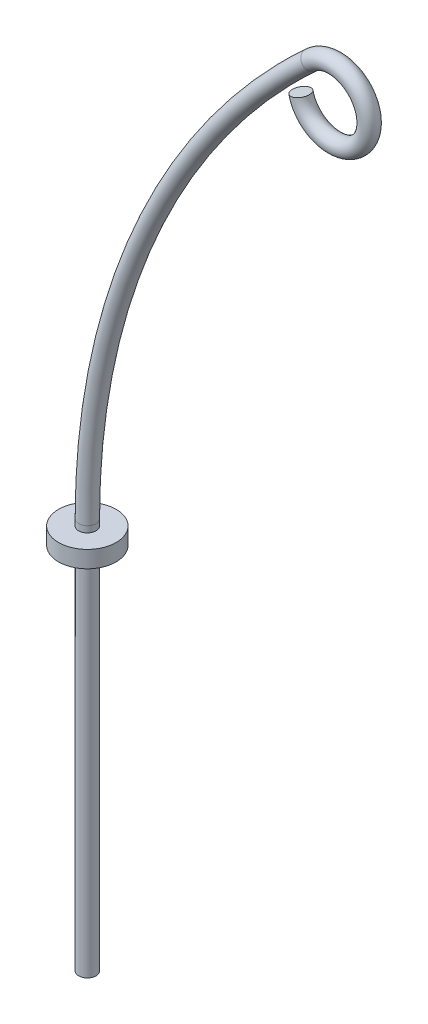
ISO-10303-21;
HEADER;
FILE_DESCRIPTION(('STEP AP214'),'2;1');
FILE_NAME('part.step','',(''),(''),'','','');
FILE_SCHEMA(('AUTOMOTIVE_DESIGN { 1 0 10303 214 1 1 1 1 }'));
ENDSEC;
DATA;
#1=APPLICATION_CONTEXT('core data for automotive mechanical design processes');
#2=APPLICATION_PROTOCOL_DEFINITION('international standard','automotive_design',2000,#1);
#3=PRODUCT_CONTEXT('',#1,'mechanical');
#4=PRODUCT('Part','Part','',(#3));
#5=PRODUCT_RELATED_PRODUCT_CATEGORY('part','',(#4));
#6=PRODUCT_DEFINITION_FORMATION('','',#4);
#7=PRODUCT_DEFINITION_CONTEXT('part definition',#1,'design');
#8=PRODUCT_DEFINITION('design','',#6,#7);
#9=PRODUCT_DEFINITION_SHAPE('','',#8);
#10=(LENGTH_UNIT() NAMED_UNIT(*) SI_UNIT(.MILLI.,.METRE.));
#11=(NAMED_UNIT(*) PLANE_ANGLE_UNIT() SI_UNIT($,.RADIAN.));
#12=(NAMED_UNIT(*) SI_UNIT($,.STERADIAN.) SOLID_ANGLE_UNIT());
#13=UNCERTAINTY_MEASURE_WITH_UNIT(LENGTH_MEASURE(1.E-05),#10,'distance_accuracy_value','');
#14=(GEOMETRIC_REPRESENTATION_CONTEXT(3) GLOBAL_UNCERTAINTY_ASSIGNED_CONTEXT((#13)) GLOBAL_UNIT_ASSIGNED_CONTEXT((#10,
#11,#12)) REPRESENTATION_CONTEXT('',''));
#15=CARTESIAN_POINT('',(0.,0.,0.));
#16=DIRECTION('',(0.,0.,1.));
#17=DIRECTION('',(1.,0.,0.));
#18=AXIS2_PLACEMENT_3D('',#15,#16,#17);
#19=CARTESIAN_POINT('',(0.,0.,0.));
#20=DIRECTION('',(0.,1.,0.));
#21=DIRECTION('',(0.,0.,1.));
#22=AXIS2_PLACEMENT_3D('',#19,#20,#21);
#23=PLANE('',#22);
#24=CARTESIAN_POINT('',(0.,0.,0.));
#25=DIRECTION('',(0.,1.,0.));
#26=DIRECTION('',(0.,0.,1.));
#27=AXIS2_PLACEMENT_3D('',#24,#25,#26);
#28=CIRCLE('',#27,0.9525);
#29=CARTESIAN_POINT('',(0.,0.,0.9525));
#30=VERTEX_POINT('',#29);
#31=EDGE_CURVE('E17',#30,#30,#28,.T.);
#32=ORIENTED_EDGE('',*,*,#31,.F.);
#33=EDGE_LOOP('',(#32));
#34=FACE_BOUND('',#33,.T.);
#35=ADVANCED_FACE('F14',(#34),#23,.F.);
#36=CARTESIAN_POINT('',(0.,0.,0.));
#37=DIRECTION('',(0.,1.,0.));
#38=DIRECTION('',(0.,0.,1.));
#39=AXIS2_PLACEMENT_3D('',#36,#37,#38);
#40=CYLINDRICAL_SURFACE('',#39,0.9525);
#41=ORIENTED_EDGE('',*,*,#31,.T.);
#42=EDGE_LOOP('',(#41));
#43=FACE_BOUND('',#42,.T.);
#44=CARTESIAN_POINT('',(0.,40.64,0.));
#45=DIRECTION('',(0.,1.,0.));
#46=DIRECTION('',(0.,0.,1.));
#47=AXIS2_PLACEMENT_3D('',#44,#45,#46);
#48=CIRCLE('',#47,0.9525);
#49=CARTESIAN_POINT('',(0.,40.64,0.9525));
#50=VERTEX_POINT('',#49);
#51=EDGE_CURVE('E99',#50,#50,#48,.F.);
#52=ORIENTED_EDGE('',*,*,#51,.T.);
#53=EDGE_LOOP('',(#52));
#54=FACE_BOUND('',#53,.T.);
#55=ADVANCED_FACE('F58',(#43,#54),#40,.T.);
#56=CARTESIAN_POINT('',(0.,40.64,0.));
#57=DIRECTION('',(0.,1.,0.));
#58=DIRECTION('',(0.,0.,1.));
#59=AXIS2_PLACEMENT_3D('',#56,#57,#58);
#60=PLANE('',#59);
#61=ORIENTED_EDGE('',*,*,#51,.F.);
#62=EDGE_LOOP('',(#61));
#63=FACE_BOUND('',#62,.T.);
#64=CARTESIAN_POINT('',(0.,40.64,0.));
#65=DIRECTION('',(0.,1.,0.));
#66=DIRECTION('',(0.,0.,1.));
#67=AXIS2_PLACEMENT_3D('',#64,#65,#66);
#68=CIRCLE('',#67,3.175);
#69=CARTESIAN_POINT('',(0.,40.64,3.175));
#70=VERTEX_POINT('',#69);
#71=EDGE_CURVE('E97',#70,#70,#68,.T.);
#72=ORIENTED_EDGE('',*,*,#71,.F.);
#73=EDGE_LOOP('',(#72));
#74=FACE_BOUND('',#73,.T.);
#75=ADVANCED_FACE('F55',(#63,#74),#60,.F.);
#76=CARTESIAN_POINT('',(0.,40.54729,0.));
#77=DIRECTION('',(0.,1.,0.));
#78=DIRECTION('',(0.,0.,1.));
#79=AXIS2_PLACEMENT_3D('',#76,#77,#78);
#80=CYLINDRICAL_SURFACE('',#79,3.175);
#81=ORIENTED_EDGE('',*,*,#71,.T.);
#82=EDGE_LOOP('',(#81));
#83=FACE_BOUND('',#82,.T.);
#84=CARTESIAN_POINT('',(0.,42.4942,0.));
#85=DIRECTION('',(0.,1.,0.));
#86=DIRECTION('',(0.,0.,1.));
#87=AXIS2_PLACEMENT_3D('',#84,#85,#86);
#88=CIRCLE('',#87,3.175);
#89=CARTESIAN_POINT('',(0.,42.4942,3.175));
#90=VERTEX_POINT('',#89);
#91=EDGE_CURVE('E40',#90,#90,#88,.T.);
#92=ORIENTED_EDGE('',*,*,#91,.F.);
#93=EDGE_LOOP('',(#92));
#94=FACE_BOUND('',#93,.T.);
#95=ADVANCED_FACE('F51',(#83,#94),#80,.T.);
#96=CARTESIAN_POINT('',(27.2596638752859,96.52,25.4));
#97=DIRECTION('',(-0.217068301612814,0.976156418016564,0.));
#98=DIRECTION('',(-0.976156418016564,-0.217068301612814,0.));
#99=AXIS2_PLACEMENT_3D('',#96,#97,#98);
#100=PLANE('',#99);
#101=CARTESIAN_POINT('',(24.4702969108035,95.8997273281414,0.));
#102=CARTESIAN_POINT('',(24.4702904445418,95.8997258902361,0.0534761719287761));
#103=CARTESIAN_POINT('',(24.4658783235665,95.8987447650917,0.107022651500153));
#104=CARTESIAN_POINT('',(24.452741678356,95.8958235639275,0.186169109245371));
#105=CARTESIAN_POINT('',(24.4472650376949,95.8946057211055,0.212388948246664));
#106=CARTESIAN_POINT('',(24.4341716634949,95.8916941421336,0.264288462679879));
#107=CARTESIAN_POINT('',(24.4265530853444,95.8899999957967,0.289967651930992));
#108=CARTESIAN_POINT('',(24.4005862120776,95.8842257315761,0.365791602146631));
#109=CARTESIAN_POINT('',(24.3791053079268,95.8794490141412,0.414851299745768));
#110=CARTESIAN_POINT('',(24.3284181131509,95.8681776819239,0.508555711509735));
#111=CARTESIAN_POINT('',(24.2992116455692,95.8616830277916,0.553200324513418));
#112=CARTESIAN_POINT('',(24.2338957453563,95.8471587043678,0.636837203748042));
#113=CARTESIAN_POINT('',(24.1977866890783,95.8391291187661,0.675829777944051));
#114=CARTESIAN_POINT('',(24.1196884664604,95.8217623850851,0.747052786685603));
#115=CARTESIAN_POINT('',(24.0776987940299,95.8124251244663,0.779282638628786));
#116=CARTESIAN_POINT('',(23.989034827213,95.7927088819297,0.836062294452608));
#117=CARTESIAN_POINT('',(23.9423607095576,95.7823299393118,0.860612387925209));
#118=CARTESIAN_POINT('',(23.8456521639588,95.7608248205039,0.901336413052785));
#119=CARTESIAN_POINT('',(23.7956177719113,95.7496986522961,0.917510434168126));
#120=CARTESIAN_POINT('',(23.6936082302561,95.7270147488287,0.941023820093909));
#121=CARTESIAN_POINT('',(23.6416330702855,95.7154570112646,0.948363137723286));
#122=CARTESIAN_POINT('',(23.5372176748056,95.692238117099,0.953998559438798));
#123=CARTESIAN_POINT('',(23.4847774392963,95.6805769604973,0.952294663524934));
#124=CARTESIAN_POINT('',(23.3809208084941,95.6574823190614,0.939892117082394));
#125=CARTESIAN_POINT('',(23.3295044077348,95.6460488330116,0.929193514589103));
#126=CARTESIAN_POINT('',(23.2291541051655,95.6237338952178,0.899104987293012));
#127=CARTESIAN_POINT('',(23.1802202298763,95.6128524493712,0.879714969661146));
#128=CARTESIAN_POINT('',(23.086223121062,95.5919502738692,0.832793746949218));
#129=CARTESIAN_POINT('',(23.0411600335857,95.5819295766906,0.805262234856397));
#130=CARTESIAN_POINT('',(22.9561887008419,95.563034466702,0.74284028183274));
#131=CARTESIAN_POINT('',(22.916280012044,95.554159955264,0.707950474756428));
#132=CARTESIAN_POINT('',(22.8427469299702,95.5378083737516,0.631807438420719));
#133=CARTESIAN_POINT('',(22.8091228793756,95.5303313798793,0.590553862389127));
#134=CARTESIAN_POINT('',(22.7491048771284,95.5169851521912,0.502824340328516));
#135=CARTESIAN_POINT('',(22.722710759875,95.5111158815507,0.456348513948862));
#136=CARTESIAN_POINT('',(22.6891102564452,95.5036441238711,0.383739485121294));
#137=CARTESIAN_POINT('',(22.6788998997027,95.5013736426695,0.359022544458131));
#138=CARTESIAN_POINT('',(22.6605555953866,95.4972944122217,0.308819758513858));
#139=CARTESIAN_POINT('',(22.6524198632813,95.4954852661485,0.283334595282693));
#140=CARTESIAN_POINT('',(22.6312377661943,95.4907749945625,0.206040360427623));
#141=CARTESIAN_POINT('',(22.6213577247161,95.4885779657012,0.153265245675408));
#142=CARTESIAN_POINT('',(22.6124328717984,95.4865933425105,0.0668383901907822));
#143=CARTESIAN_POINT('',(22.6107148918195,95.4862113146005,0.0334329355449093));
#144=CARTESIAN_POINT('',(22.6107254007437,95.4862136514742,-0.0534761719287885));
#145=CARTESIAN_POINT('',(22.615137521719,95.4871947766187,-0.107022651500165));
#146=CARTESIAN_POINT('',(22.6282741669295,95.4901159777828,-0.186169109245384));
#147=CARTESIAN_POINT('',(22.6337508075906,95.4913338206049,-0.212388948246677));
#148=CARTESIAN_POINT('',(22.6468441817906,95.4942453995768,-0.264288462679892));
#149=CARTESIAN_POINT('',(22.6544627599411,95.4959395459137,-0.289967651931004));
#150=CARTESIAN_POINT('',(22.6804296332079,95.5017138101342,-0.365791602146642));
#151=CARTESIAN_POINT('',(22.7019105373587,95.5064905275691,-0.414851299745783));
#152=CARTESIAN_POINT('',(22.7525977321346,95.5177618597864,-0.508555711509751));
#153=CARTESIAN_POINT('',(22.7818041997164,95.5242565139188,-0.553200324513429));
#154=CARTESIAN_POINT('',(22.8471200999292,95.5387808373426,-0.636837203748051));
#155=CARTESIAN_POINT('',(22.8832291562072,95.5468104229443,-0.675829777944063));
#156=CARTESIAN_POINT('',(22.9613273788252,95.5641771566252,-0.747052786685616));
#157=CARTESIAN_POINT('',(23.0033170512556,95.5735144172441,-0.779282638628796));
#158=CARTESIAN_POINT('',(23.0919810180725,95.5932306597806,-0.836062294452616));
#159=CARTESIAN_POINT('',(23.138655135728,95.6036096023985,-0.860612387925217));
#160=CARTESIAN_POINT('',(23.2353636813267,95.6251147212065,-0.901336413052792));
#161=CARTESIAN_POINT('',(23.2853980733742,95.6362408894143,-0.91751043416813));
#162=CARTESIAN_POINT('',(23.3874076150294,95.6589247928817,-0.941023820093911));
#163=CARTESIAN_POINT('',(23.439382775,95.6704825304457,-0.948363137723288));
#164=CARTESIAN_POINT('',(23.5437981704799,95.6937014246114,-0.953998559438799));
#165=CARTESIAN_POINT('',(23.5962384059892,95.705362581213,-0.952294663524934));
#166=CARTESIAN_POINT('',(23.7000950367915,95.7284572226489,-0.93989211708239));
#167=CARTESIAN_POINT('',(23.7515114375507,95.7398907086988,-0.929193514589098));
#168=CARTESIAN_POINT('',(23.85186174012,95.7622056464926,-0.899104987293007));
#169=CARTESIAN_POINT('',(23.9007956154093,95.7730870923391,-0.879714969661141));
#170=CARTESIAN_POINT('',(23.9947927242235,95.7939892678411,-0.832793746949211));
#171=CARTESIAN_POINT('',(24.0398558116998,95.8040099650198,-0.805262234856388));
#172=CARTESIAN_POINT('',(24.1248271444436,95.8229050750083,-0.74284028183273));
#173=CARTESIAN_POINT('',(24.1647358332416,95.8317795864463,-0.707950474756419));
#174=CARTESIAN_POINT('',(24.2382689153153,95.8481311679588,-0.631807438420709));
#175=CARTESIAN_POINT('',(24.2718929659099,95.8556081618311,-0.590553862389116));
#176=CARTESIAN_POINT('',(24.3319109681572,95.8689543895191,-0.502824340328505));
#177=CARTESIAN_POINT('',(24.3583050854106,95.8748236601596,-0.456348513948855));
#178=CARTESIAN_POINT('',(24.3919055888404,95.8822954178392,-0.383739485121286));
#179=CARTESIAN_POINT('',(24.4021159455828,95.8845658990409,-0.35902254445812));
#180=CARTESIAN_POINT('',(24.4204602498989,95.8886451294886,-0.308819758513846));
#181=CARTESIAN_POINT('',(24.4285959820043,95.8904542755618,-0.283334595282681));
#182=CARTESIAN_POINT('',(24.4497780790912,95.8951645471478,-0.206040360427613));
#183=CARTESIAN_POINT('',(24.4596581205694,95.8973615760091,-0.153265245675397));
#184=CARTESIAN_POINT('',(24.4685829734871,95.8993461991999,-0.0668383901907789));
#185=CARTESIAN_POINT('',(24.470300953466,95.8997282271099,-0.0334329355449141));
#186=CARTESIAN_POINT('',(24.4702969108035,95.8997273281414,0.));
#187=B_SPLINE_CURVE_WITH_KNOTS('',3,(#101,#102,#103,#104,#105,#106,#107,#108,#109,#110,#111,
#112,#113,#114,#115,#116,#117,#118,#119,#120,#121,#122,#123,#124,#125,#126,#127,#128,#129,#130,
#131,#132,#133,#134,#135,#136,#137,#138,#139,#140,#141,#142,#143,#144,#145,#146,#147,#148,#149,
#150,#151,#152,#153,#154,#155,#156,#157,#158,#159,#160,#161,#162,#163,#164,#165,#166,#167,#168,
#169,#170,#171,#172,#173,#174,#175,#176,#177,#178,#179,#180,#181,#182,#183,#184,#185,#186),
.UNSPECIFIED.,.T.,.F.,(4,2,2,2,2,2,2,2,2,2,2,2,2,2,2,2,2,2,2,2,2,2,2,2,2,2,2,2,2,2,2,2,2,2,2,2,
2,2,2,2,2,2,4),(0.,0.16030984359682,0.240673423468533,0.321106424636362,0.481586166402148,
0.642069584327493,0.802544254634194,0.963032744016644,1.12351518089362,1.28399590370789,
1.44447748355354,1.60495906339918,1.76543978621346,1.92592222309043,2.08641071247288,
2.24688538277958,2.40736880070493,2.56784854247072,2.64828154363855,2.72864512351026,
2.88895496710708,2.98917958070369,3.14948942430051,3.22985300417223,3.31028600534005,
3.47076574710584,3.63124916503119,3.79172383533789,3.95221232472034,4.11269476159732,
4.27317548441159,4.43365706425723,4.59413864410287,4.75461936691714,4.91510180379412,
5.07559029317658,5.23606496348328,5.39654838140862,5.55702812317441,5.63746112434224,
5.71782470421395,5.87813454781077,5.97835916140736),.UNSPECIFIED.);
#188=CARTESIAN_POINT('',(24.4702969108035,95.8997273281414,0.));
#189=VERTEX_POINT('',#188);
#190=EDGE_CURVE('E32',#189,#189,#187,.T.);
#191=ORIENTED_EDGE('',*,*,#190,.F.);
#192=EDGE_LOOP('',(#191));
#193=FACE_BOUND('',#192,.T.);
#194=ADVANCED_FACE('F46',(#193),#100,.T.);
#195=CARTESIAN_POINT('',(0.,42.4942,0.));
#196=DIRECTION('',(0.,1.,0.));
#197=DIRECTION('',(0.,0.,1.));
#198=AXIS2_PLACEMENT_3D('',#195,#196,#197);
#199=PLANE('',#198);
#200=CARTESIAN_POINT('',(0.,42.4942,0.));
#201=DIRECTION('',(0.,1.,0.));
#202=DIRECTION('',(0.,0.,1.));
#203=AXIS2_PLACEMENT_3D('',#200,#201,#202);
#204=CIRCLE('',#203,0.9525);
#205=CARTESIAN_POINT('',(0.,42.4942,0.9525));
#206=VERTEX_POINT('',#205);
#207=EDGE_CURVE('E26',#206,#206,#204,.T.);
#208=ORIENTED_EDGE('',*,*,#207,.F.);
#209=EDGE_LOOP('',(#208));
#210=FACE_BOUND('',#209,.T.);
#211=ORIENTED_EDGE('',*,*,#91,.T.);
#212=EDGE_LOOP('',(#211));
#213=FACE_BOUND('',#212,.T.);
#214=ADVANCED_FACE('F50',(#210,#213),#199,.T.);
#215=CARTESIAN_POINT('',(27.2596638752859,96.52,0.));
#216=DIRECTION('',(0.,0.,-1.));
#217=DIRECTION('',(0.676064872561325,-0.736842105263156,0.));
#218=AXIS2_PLACEMENT_3D('',#215,#216,#217);
#219=TOROIDAL_SURFACE('',#218,3.80999999999999,0.9525);
#220=ORIENTED_EDGE('',*,*,#190,.T.);
#221=EDGE_LOOP('',(#220));
#222=FACE_BOUND('',#221,.T.);
#223=CARTESIAN_POINT('',(24.6838567108272,99.3273684210526,0.));
#224=DIRECTION('',(0.736842105263158,0.676064872561323,0.));
#225=DIRECTION('',(-0.676064872561323,0.736842105263158,0.));
#226=AXIS2_PLACEMENT_3D('',#223,#224,#225);
#227=CIRCLE('',#226,0.9525);
#228=CARTESIAN_POINT('',(24.0399049197125,100.029210526316,0.));
#229=VERTEX_POINT('',#228);
#230=EDGE_CURVE('E21',#229,#229,#227,.F.);
#231=ORIENTED_EDGE('',*,*,#230,.F.);
#232=EDGE_LOOP('',(#231));
#233=FACE_BOUND('',#232,.T.);
#234=ADVANCED_FACE('F42',(#222,#233),#219,.T.);
#235=CARTESIAN_POINT('',(0.,0.,0.));
#236=DIRECTION('',(0.,1.,0.));
#237=DIRECTION('',(0.,0.,1.));
#238=AXIS2_PLACEMENT_3D('',#235,#236,#237);
#239=CYLINDRICAL_SURFACE('',#238,0.9525);
#240=CARTESIAN_POINT('',(0.,43.18,0.));
#241=DIRECTION('',(0.,1.,0.));
#242=DIRECTION('',(-1.,0.,0.));
#243=AXIS2_PLACEMENT_3D('',#240,#241,#242);
#244=CIRCLE('',#243,0.9525);
#245=CARTESIAN_POINT('',(-0.9525,43.18,0.));
#246=VERTEX_POINT('',#245);
#247=EDGE_CURVE('E9',#246,#246,#244,.T.);
#248=ORIENTED_EDGE('',*,*,#247,.F.);
#249=EDGE_LOOP('',(#248));
#250=FACE_BOUND('',#249,.T.);
#251=ORIENTED_EDGE('',*,*,#207,.T.);
#252=EDGE_LOOP('',(#251));
#253=FACE_BOUND('',#252,.T.);
#254=ADVANCED_FACE('F71',(#250,#253),#239,.T.);
#255=CARTESIAN_POINT('',(76.2,43.18,0.));
#256=DIRECTION('',(0.,0.,-1.));
#257=DIRECTION('',(1.,0.,0.));
#258=AXIS2_PLACEMENT_3D('',#255,#256,#257);
#259=TOROIDAL_SURFACE('',#258,76.2,0.9525);
#260=ORIENTED_EDGE('',*,*,#230,.T.);
#261=EDGE_LOOP('',(#260));
#262=FACE_BOUND('',#261,.T.);
#263=ORIENTED_EDGE('',*,*,#247,.T.);
#264=EDGE_LOOP('',(#263));
#265=FACE_BOUND('',#264,.T.);
#266=ADVANCED_FACE('F69',(#262,#265),#259,.T.);
#267=CLOSED_SHELL('',(#35,#55,#75,#95,#194,#214,#234,#254,#266));
#268=MANIFOLD_SOLID_BREP('B1',#267);
#269=ADVANCED_BREP_SHAPE_REPRESENTATION('',(#18,#268),#14);
#270=SHAPE_DEFINITION_REPRESENTATION(#9,#269);
ENDSEC;
END-ISO-10303-21;
